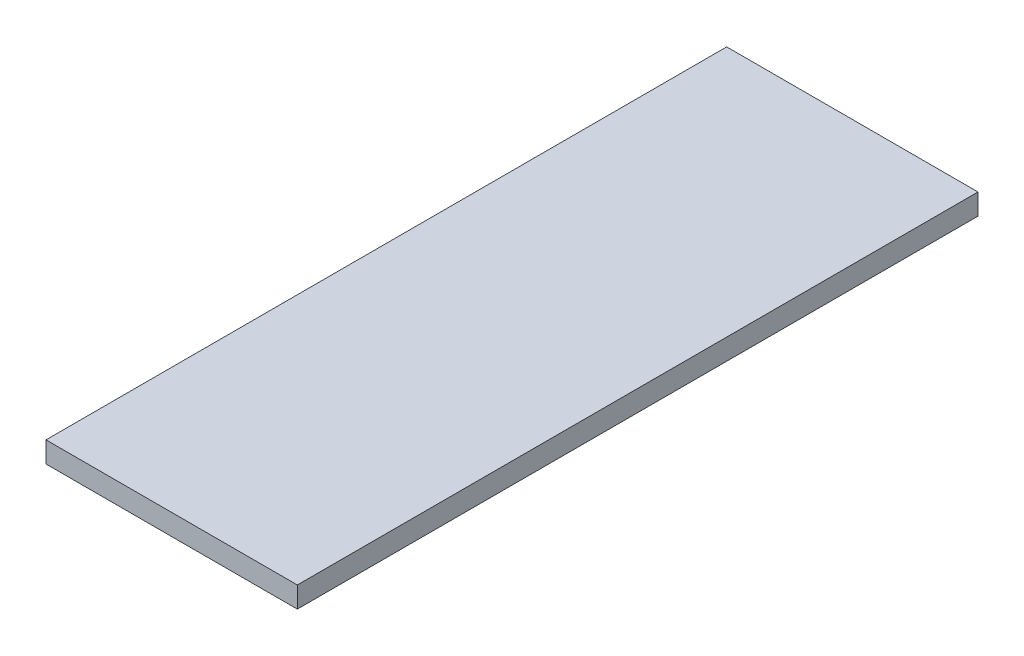
ISO-10303-21;
HEADER;
FILE_DESCRIPTION(('STEP AP214'),'2;1');
FILE_NAME('part.step','',(''),(''),'','','');
FILE_SCHEMA(('AUTOMOTIVE_DESIGN { 1 0 10303 214 1 1 1 1 }'));
ENDSEC;
DATA;
#1=APPLICATION_CONTEXT('core data for automotive mechanical design processes');
#2=APPLICATION_PROTOCOL_DEFINITION('international standard','automotive_design',2000,#1);
#3=PRODUCT_CONTEXT('',#1,'mechanical');
#4=PRODUCT('Part','Part','',(#3));
#5=PRODUCT_RELATED_PRODUCT_CATEGORY('part','',(#4));
#6=PRODUCT_DEFINITION_FORMATION('','',#4);
#7=PRODUCT_DEFINITION_CONTEXT('part definition',#1,'design');
#8=PRODUCT_DEFINITION('design','',#6,#7);
#9=PRODUCT_DEFINITION_SHAPE('','',#8);
#10=(LENGTH_UNIT() NAMED_UNIT(*) SI_UNIT(.MILLI.,.METRE.));
#11=(NAMED_UNIT(*) PLANE_ANGLE_UNIT() SI_UNIT($,.RADIAN.));
#12=(NAMED_UNIT(*) SI_UNIT($,.STERADIAN.) SOLID_ANGLE_UNIT());
#13=UNCERTAINTY_MEASURE_WITH_UNIT(LENGTH_MEASURE(1.E-05),#10,'distance_accuracy_value','');
#14=(GEOMETRIC_REPRESENTATION_CONTEXT(3) GLOBAL_UNCERTAINTY_ASSIGNED_CONTEXT((#13)) GLOBAL_UNIT_ASSIGNED_CONTEXT((#10,
#11,#12)) REPRESENTATION_CONTEXT('',''));
#15=CARTESIAN_POINT('',(0.,0.,0.));
#16=DIRECTION('',(0.,0.,1.));
#17=DIRECTION('',(1.,0.,0.));
#18=AXIS2_PLACEMENT_3D('',#15,#16,#17);
#19=CARTESIAN_POINT('',(0.,20.,0.));
#20=DIRECTION('',(1.,0.,0.));
#21=DIRECTION('',(0.,0.,-1.));
#22=AXIS2_PLACEMENT_3D('',#19,#20,#21);
#23=PLANE('',#22);
#24=DIRECTION('',(0.,0.,1.));
#25=VECTOR('',#24,1.);
#26=CARTESIAN_POINT('',(0.,0.,0.));
#27=LINE('',#26,#25);
#28=CARTESIAN_POINT('',(0.,0.,-650.));
#29=VERTEX_POINT('',#28);
#30=CARTESIAN_POINT('',(0.,0.,0.));
#31=VERTEX_POINT('',#30);
#32=EDGE_CURVE('E104',#29,#31,#27,.T.);
#33=ORIENTED_EDGE('',*,*,#32,.T.);
#34=DIRECTION('',(0.,-1.,0.));
#35=VECTOR('',#34,1.);
#36=CARTESIAN_POINT('',(0.,20.,0.));
#37=LINE('',#36,#35);
#38=CARTESIAN_POINT('',(0.,20.,0.));
#39=VERTEX_POINT('',#38);
#40=EDGE_CURVE('E11',#39,#31,#37,.T.);
#41=ORIENTED_EDGE('',*,*,#40,.F.);
#42=DIRECTION('',(0.,0.,1.));
#43=VECTOR('',#42,1.);
#44=CARTESIAN_POINT('',(0.,20.,0.));
#45=LINE('',#44,#43);
#46=CARTESIAN_POINT('',(0.,20.,-650.));
#47=VERTEX_POINT('',#46);
#48=EDGE_CURVE('E92',#47,#39,#45,.T.);
#49=ORIENTED_EDGE('',*,*,#48,.F.);
#50=DIRECTION('',(0.,-1.,0.));
#51=VECTOR('',#50,1.);
#52=CARTESIAN_POINT('',(0.,20.,-650.));
#53=LINE('',#52,#51);
#54=EDGE_CURVE('E100',#47,#29,#53,.T.);
#55=ORIENTED_EDGE('',*,*,#54,.T.);
#56=EDGE_LOOP('',(#33,#41,#49,#55));
#57=FACE_BOUND('',#56,.T.);
#58=ADVANCED_FACE('F41',(#57),#23,.F.);
#59=CARTESIAN_POINT('',(0.,20.,0.));
#60=DIRECTION('',(0.,0.,-1.));
#61=DIRECTION('',(-1.,0.,0.));
#62=AXIS2_PLACEMENT_3D('',#59,#60,#61);
#63=PLANE('',#62);
#64=DIRECTION('',(1.,0.,0.));
#65=VECTOR('',#64,1.);
#66=CARTESIAN_POINT('',(0.,0.,0.));
#67=LINE('',#66,#65);
#68=CARTESIAN_POINT('',(240.,0.,0.));
#69=VERTEX_POINT('',#68);
#70=EDGE_CURVE('E96',#31,#69,#67,.T.);
#71=ORIENTED_EDGE('',*,*,#70,.T.);
#72=DIRECTION('',(0.,-1.,0.));
#73=VECTOR('',#72,1.);
#74=CARTESIAN_POINT('',(240.,20.,0.));
#75=LINE('',#74,#73);
#76=CARTESIAN_POINT('',(240.,20.,0.));
#77=VERTEX_POINT('',#76);
#78=EDGE_CURVE('E49',#77,#69,#75,.T.);
#79=ORIENTED_EDGE('',*,*,#78,.F.);
#80=DIRECTION('',(1.,0.,0.));
#81=VECTOR('',#80,1.);
#82=CARTESIAN_POINT('',(0.,20.,0.));
#83=LINE('',#82,#81);
#84=EDGE_CURVE('E87',#39,#77,#83,.T.);
#85=ORIENTED_EDGE('',*,*,#84,.F.);
#86=ORIENTED_EDGE('',*,*,#40,.T.);
#87=EDGE_LOOP('',(#71,#79,#85,#86));
#88=FACE_BOUND('',#87,.T.);
#89=ADVANCED_FACE('F95',(#88),#63,.F.);
#90=CARTESIAN_POINT('',(240.,20.,0.));
#91=DIRECTION('',(-1.,0.,0.));
#92=DIRECTION('',(0.,0.,1.));
#93=AXIS2_PLACEMENT_3D('',#90,#91,#92);
#94=PLANE('',#93);
#95=DIRECTION('',(0.,0.,-1.));
#96=VECTOR('',#95,1.);
#97=CARTESIAN_POINT('',(240.,0.,0.));
#98=LINE('',#97,#96);
#99=CARTESIAN_POINT('',(240.,0.,-650.));
#100=VERTEX_POINT('',#99);
#101=EDGE_CURVE('E74',#69,#100,#98,.T.);
#102=ORIENTED_EDGE('',*,*,#101,.T.);
#103=DIRECTION('',(0.,-1.,0.));
#104=VECTOR('',#103,1.);
#105=CARTESIAN_POINT('',(240.,20.,-650.));
#106=LINE('',#105,#104);
#107=CARTESIAN_POINT('',(240.,20.,-650.));
#108=VERTEX_POINT('',#107);
#109=EDGE_CURVE('E97',#108,#100,#106,.T.);
#110=ORIENTED_EDGE('',*,*,#109,.F.);
#111=DIRECTION('',(0.,0.,-1.));
#112=VECTOR('',#111,1.);
#113=CARTESIAN_POINT('',(240.,20.,0.));
#114=LINE('',#113,#112);
#115=EDGE_CURVE('E90',#77,#108,#114,.T.);
#116=ORIENTED_EDGE('',*,*,#115,.F.);
#117=ORIENTED_EDGE('',*,*,#78,.T.);
#118=EDGE_LOOP('',(#102,#110,#116,#117));
#119=FACE_BOUND('',#118,.T.);
#120=ADVANCED_FACE('F98',(#119),#94,.F.);
#121=CARTESIAN_POINT('',(0.,20.,-650.));
#122=DIRECTION('',(0.,0.,1.));
#123=DIRECTION('',(1.,0.,0.));
#124=AXIS2_PLACEMENT_3D('',#121,#122,#123);
#125=PLANE('',#124);
#126=DIRECTION('',(-1.,0.,0.));
#127=VECTOR('',#126,1.);
#128=CARTESIAN_POINT('',(0.,0.,-650.));
#129=LINE('',#128,#127);
#130=EDGE_CURVE('E80',#100,#29,#129,.T.);
#131=ORIENTED_EDGE('',*,*,#130,.T.);
#132=ORIENTED_EDGE('',*,*,#54,.F.);
#133=DIRECTION('',(-1.,0.,0.));
#134=VECTOR('',#133,1.);
#135=CARTESIAN_POINT('',(0.,20.,-650.));
#136=LINE('',#135,#134);
#137=EDGE_CURVE('E57',#108,#47,#136,.T.);
#138=ORIENTED_EDGE('',*,*,#137,.F.);
#139=ORIENTED_EDGE('',*,*,#109,.T.);
#140=EDGE_LOOP('',(#131,#132,#138,#139));
#141=FACE_BOUND('',#140,.T.);
#142=ADVANCED_FACE('F111',(#141),#125,.F.);
#143=CARTESIAN_POINT('',(0.,20.,0.));
#144=DIRECTION('',(0.,-1.,0.));
#145=DIRECTION('',(0.,0.,-1.));
#146=AXIS2_PLACEMENT_3D('',#143,#144,#145);
#147=PLANE('',#146);
#148=ORIENTED_EDGE('',*,*,#48,.T.);
#149=ORIENTED_EDGE('',*,*,#84,.T.);
#150=ORIENTED_EDGE('',*,*,#115,.T.);
#151=ORIENTED_EDGE('',*,*,#137,.T.);
#152=EDGE_LOOP('',(#148,#149,#150,#151));
#153=FACE_BOUND('',#152,.T.);
#154=ADVANCED_FACE('F88',(#153),#147,.F.);
#155=CARTESIAN_POINT('',(0.,0.,0.));
#156=DIRECTION('',(0.,-1.,0.));
#157=DIRECTION('',(0.,0.,-1.));
#158=AXIS2_PLACEMENT_3D('',#155,#156,#157);
#159=PLANE('',#158);
#160=ORIENTED_EDGE('',*,*,#32,.F.);
#161=ORIENTED_EDGE('',*,*,#130,.F.);
#162=ORIENTED_EDGE('',*,*,#101,.F.);
#163=ORIENTED_EDGE('',*,*,#70,.F.);
#164=EDGE_LOOP('',(#160,#161,#162,#163));
#165=FACE_BOUND('',#164,.T.);
#166=ADVANCED_FACE('F114',(#165),#159,.T.);
#167=CLOSED_SHELL('',(#58,#89,#120,#142,#154,#166));
#168=MANIFOLD_SOLID_BREP('B2',#167);
#169=ADVANCED_BREP_SHAPE_REPRESENTATION('',(#18,#168),#14);
#170=SHAPE_DEFINITION_REPRESENTATION(#9,#169);
ENDSEC;
END-ISO-10303-21;
